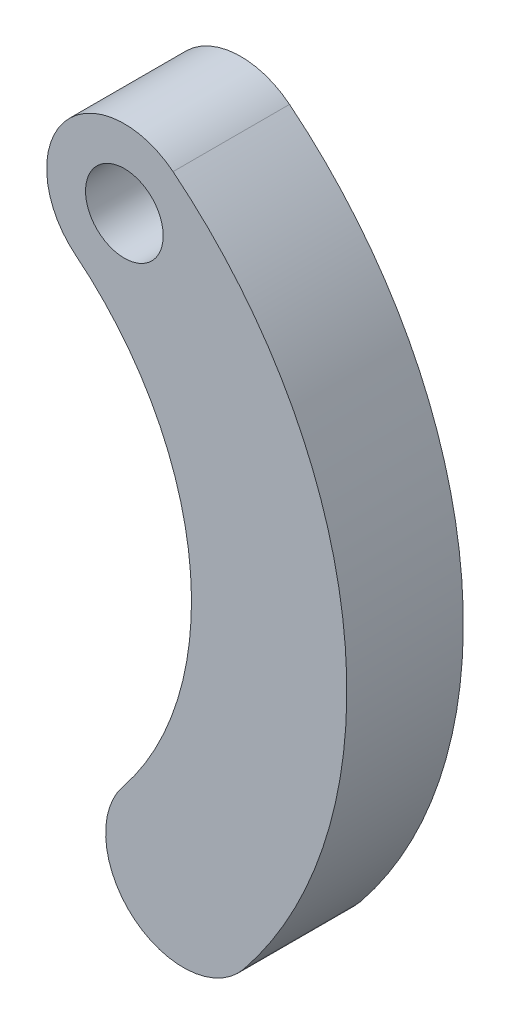
ISO-10303-21;
HEADER;
FILE_DESCRIPTION(('STEP AP214'),'2;1');
FILE_NAME('part.step','',(''),(''),'','','');
FILE_SCHEMA(('AUTOMOTIVE_DESIGN { 1 0 10303 214 1 1 1 1 }'));
ENDSEC;
DATA;
#1=APPLICATION_CONTEXT('core data for automotive mechanical design processes');
#2=APPLICATION_PROTOCOL_DEFINITION('international standard','automotive_design',2000,#1);
#3=PRODUCT_CONTEXT('',#1,'mechanical');
#4=PRODUCT('Part','Part','',(#3));
#5=PRODUCT_RELATED_PRODUCT_CATEGORY('part','',(#4));
#6=PRODUCT_DEFINITION_FORMATION('','',#4);
#7=PRODUCT_DEFINITION_CONTEXT('part definition',#1,'design');
#8=PRODUCT_DEFINITION('design','',#6,#7);
#9=PRODUCT_DEFINITION_SHAPE('','',#8);
#10=(LENGTH_UNIT() NAMED_UNIT(*) SI_UNIT(.MILLI.,.METRE.));
#11=(NAMED_UNIT(*) PLANE_ANGLE_UNIT() SI_UNIT($,.RADIAN.));
#12=(NAMED_UNIT(*) SI_UNIT($,.STERADIAN.) SOLID_ANGLE_UNIT());
#13=UNCERTAINTY_MEASURE_WITH_UNIT(LENGTH_MEASURE(1.E-05),#10,'distance_accuracy_value','');
#14=(GEOMETRIC_REPRESENTATION_CONTEXT(3) GLOBAL_UNCERTAINTY_ASSIGNED_CONTEXT((#13)) GLOBAL_UNIT_ASSIGNED_CONTEXT((#10,
#11,#12)) REPRESENTATION_CONTEXT('',''));
#15=CARTESIAN_POINT('',(0.,0.,0.));
#16=DIRECTION('',(0.,0.,1.));
#17=DIRECTION('',(1.,0.,0.));
#18=AXIS2_PLACEMENT_3D('',#15,#16,#17);
#19=CARTESIAN_POINT('',(-2.37615621415008,-1.42492021233816,3.));
#20=DIRECTION('',(0.,0.,1.));
#21=DIRECTION('',(1.,0.,0.));
#22=AXIS2_PLACEMENT_3D('',#19,#20,#21);
#23=PLANE('',#22);
#24=CARTESIAN_POINT('',(1.51858062795517,-4.56036674046586,3.));
#25=DIRECTION('',(0.,0.,1.));
#26=DIRECTION('',(1.,0.,0.));
#27=AXIS2_PLACEMENT_3D('',#24,#25,#26);
#28=CIRCLE('',#27,2.);
#29=CARTESIAN_POINT('',(-0.0393141088869346,-3.30618812921478,3.));
#30=VERTEX_POINT('',#29);
#31=CARTESIAN_POINT('',(3.07647536479727,-5.81454535171694,3.));
#32=VERTEX_POINT('',#31);
#33=EDGE_CURVE('E85',#30,#32,#28,.T.);
#34=ORIENTED_EDGE('',*,*,#33,.T.);
#35=CARTESIAN_POINT('',(-6.27089305625533,1.71052631578953,3.));
#36=DIRECTION('',(0.,0.,1.));
#37=DIRECTION('',(1.,0.,0.));
#38=AXIS2_PLACEMENT_3D('',#35,#36,#37);
#39=CIRCLE('',#38,12.);
#40=CARTESIAN_POINT('',(1.25417861125115,11.0578947368421,3.));
#41=VERTEX_POINT('',#40);
#42=EDGE_CURVE('E80',#32,#41,#39,.T.);
#43=ORIENTED_EDGE('',*,*,#42,.T.);
#44=CARTESIAN_POINT('',(0.,9.50000000000003,3.));
#45=DIRECTION('',(0.,0.,1.));
#46=DIRECTION('',(1.,0.,0.));
#47=AXIS2_PLACEMENT_3D('',#44,#45,#46);
#48=CIRCLE('',#47,2.);
#49=CARTESIAN_POINT('',(-1.25417861125101,7.94210526315793,3.));
#50=VERTEX_POINT('',#49);
#51=EDGE_CURVE('E83',#41,#50,#48,.T.);
#52=ORIENTED_EDGE('',*,*,#51,.T.);
#53=CARTESIAN_POINT('',(-6.27089305625533,1.71052631578953,3.));
#54=DIRECTION('',(0.,0.,-1.));
#55=DIRECTION('',(1.,0.,0.));
#56=AXIS2_PLACEMENT_3D('',#53,#54,#55);
#57=CIRCLE('',#56,8.);
#58=EDGE_CURVE('E50',#50,#30,#57,.T.);
#59=ORIENTED_EDGE('',*,*,#58,.T.);
#60=EDGE_LOOP('',(#34,#43,#52,#59));
#61=FACE_BOUND('',#60,.T.);
#62=CARTESIAN_POINT('',(0.,9.50000000000003,3.));
#63=DIRECTION('',(0.,0.,1.));
#64=DIRECTION('',(1.,0.,0.));
#65=AXIS2_PLACEMENT_3D('',#62,#63,#64);
#66=CIRCLE('',#65,1.);
#67=CARTESIAN_POINT('',(1.00000000000007,9.50000000000003,3.));
#68=VERTEX_POINT('',#67);
#69=EDGE_CURVE('E100',#68,#68,#66,.T.);
#70=ORIENTED_EDGE('',*,*,#69,.F.);
#71=EDGE_LOOP('',(#70));
#72=FACE_BOUND('',#71,.T.);
#73=ADVANCED_FACE('F33',(#61,#72),#23,.T.);
#74=CARTESIAN_POINT('',(-2.37615621415008,-1.42492021233816,0.));
#75=DIRECTION('',(0.,0.,1.));
#76=DIRECTION('',(1.,0.,0.));
#77=AXIS2_PLACEMENT_3D('',#74,#75,#76);
#78=PLANE('',#77);
#79=CARTESIAN_POINT('',(1.51858062795517,-4.56036674046586,0.));
#80=DIRECTION('',(0.,0.,1.));
#81=DIRECTION('',(1.,0.,0.));
#82=AXIS2_PLACEMENT_3D('',#79,#80,#81);
#83=CIRCLE('',#82,2.);
#84=CARTESIAN_POINT('',(-0.0393141088869346,-3.30618812921478,0.));
#85=VERTEX_POINT('',#84);
#86=CARTESIAN_POINT('',(3.07647536479727,-5.81454535171694,0.));
#87=VERTEX_POINT('',#86);
#88=EDGE_CURVE('E97',#85,#87,#83,.T.);
#89=ORIENTED_EDGE('',*,*,#88,.F.);
#90=CARTESIAN_POINT('',(-6.27089305625533,1.71052631578953,0.));
#91=DIRECTION('',(0.,0.,-1.));
#92=DIRECTION('',(1.,0.,0.));
#93=AXIS2_PLACEMENT_3D('',#90,#91,#92);
#94=CIRCLE('',#93,8.);
#95=CARTESIAN_POINT('',(-1.25417861125101,7.94210526315793,0.));
#96=VERTEX_POINT('',#95);
#97=EDGE_CURVE('E73',#96,#85,#94,.T.);
#98=ORIENTED_EDGE('',*,*,#97,.F.);
#99=CARTESIAN_POINT('',(0.,9.50000000000003,0.));
#100=DIRECTION('',(0.,0.,1.));
#101=DIRECTION('',(1.,0.,0.));
#102=AXIS2_PLACEMENT_3D('',#99,#100,#101);
#103=CIRCLE('',#102,2.);
#104=CARTESIAN_POINT('',(1.25417861125115,11.0578947368421,0.));
#105=VERTEX_POINT('',#104);
#106=EDGE_CURVE('E67',#105,#96,#103,.T.);
#107=ORIENTED_EDGE('',*,*,#106,.F.);
#108=CARTESIAN_POINT('',(-6.27089305625533,1.71052631578953,0.));
#109=DIRECTION('',(0.,0.,1.));
#110=DIRECTION('',(1.,0.,0.));
#111=AXIS2_PLACEMENT_3D('',#108,#109,#110);
#112=CIRCLE('',#111,12.);
#113=EDGE_CURVE('E89',#87,#105,#112,.T.);
#114=ORIENTED_EDGE('',*,*,#113,.F.);
#115=EDGE_LOOP('',(#89,#98,#107,#114));
#116=FACE_BOUND('',#115,.T.);
#117=CARTESIAN_POINT('',(0.,9.50000000000003,0.));
#118=DIRECTION('',(0.,0.,1.));
#119=DIRECTION('',(1.,0.,0.));
#120=AXIS2_PLACEMENT_3D('',#117,#118,#119);
#121=CIRCLE('',#120,1.);
#122=CARTESIAN_POINT('',(1.00000000000007,9.50000000000003,0.));
#123=VERTEX_POINT('',#122);
#124=EDGE_CURVE('E112',#123,#123,#121,.T.);
#125=ORIENTED_EDGE('',*,*,#124,.T.);
#126=EDGE_LOOP('',(#125));
#127=FACE_BOUND('',#126,.T.);
#128=ADVANCED_FACE('F108',(#116,#127),#78,.F.);
#129=CARTESIAN_POINT('',(1.51858062795517,-4.56036674046586,3.));
#130=DIRECTION('',(0.,0.,-1.));
#131=DIRECTION('',(-1.,0.,0.));
#132=AXIS2_PLACEMENT_3D('',#129,#130,#131);
#133=CYLINDRICAL_SURFACE('',#132,2.);
#134=ORIENTED_EDGE('',*,*,#88,.T.);
#135=DIRECTION('',(0.,0.,-1.));
#136=VECTOR('',#135,1.);
#137=CARTESIAN_POINT('',(3.07647536479727,-5.81454535171694,3.));
#138=LINE('',#137,#136);
#139=EDGE_CURVE('E11',#32,#87,#138,.T.);
#140=ORIENTED_EDGE('',*,*,#139,.F.);
#141=ORIENTED_EDGE('',*,*,#33,.F.);
#142=DIRECTION('',(0.,0.,-1.));
#143=VECTOR('',#142,1.);
#144=CARTESIAN_POINT('',(-0.0393141088869346,-3.30618812921478,3.));
#145=LINE('',#144,#143);
#146=EDGE_CURVE('E93',#30,#85,#145,.T.);
#147=ORIENTED_EDGE('',*,*,#146,.T.);
#148=EDGE_LOOP('',(#134,#140,#141,#147));
#149=FACE_BOUND('',#148,.T.);
#150=ADVANCED_FACE('F35',(#149),#133,.T.);
#151=CARTESIAN_POINT('',(-6.27089305625533,1.71052631578953,3.));
#152=DIRECTION('',(0.,0.,-1.));
#153=DIRECTION('',(-1.,0.,0.));
#154=AXIS2_PLACEMENT_3D('',#151,#152,#153);
#155=CYLINDRICAL_SURFACE('',#154,12.);
#156=ORIENTED_EDGE('',*,*,#113,.T.);
#157=DIRECTION('',(0.,0.,-1.));
#158=VECTOR('',#157,1.);
#159=CARTESIAN_POINT('',(1.25417861125115,11.0578947368421,3.));
#160=LINE('',#159,#158);
#161=EDGE_CURVE('E42',#41,#105,#160,.T.);
#162=ORIENTED_EDGE('',*,*,#161,.F.);
#163=ORIENTED_EDGE('',*,*,#42,.F.);
#164=ORIENTED_EDGE('',*,*,#139,.T.);
#165=EDGE_LOOP('',(#156,#162,#163,#164));
#166=FACE_BOUND('',#165,.T.);
#167=ADVANCED_FACE('F88',(#166),#155,.T.);
#168=CARTESIAN_POINT('',(0.,9.50000000000003,3.));
#169=DIRECTION('',(0.,0.,-1.));
#170=DIRECTION('',(-1.,0.,0.));
#171=AXIS2_PLACEMENT_3D('',#168,#169,#170);
#172=CYLINDRICAL_SURFACE('',#171,2.);
#173=ORIENTED_EDGE('',*,*,#106,.T.);
#174=DIRECTION('',(0.,0.,-1.));
#175=VECTOR('',#174,1.);
#176=CARTESIAN_POINT('',(-1.25417861125101,7.94210526315793,3.));
#177=LINE('',#176,#175);
#178=EDGE_CURVE('E90',#50,#96,#177,.T.);
#179=ORIENTED_EDGE('',*,*,#178,.F.);
#180=ORIENTED_EDGE('',*,*,#51,.F.);
#181=ORIENTED_EDGE('',*,*,#161,.T.);
#182=EDGE_LOOP('',(#173,#179,#180,#181));
#183=FACE_BOUND('',#182,.T.);
#184=ADVANCED_FACE('F91',(#183),#172,.T.);
#185=CARTESIAN_POINT('',(-6.27089305625533,1.71052631578953,3.));
#186=DIRECTION('',(0.,0.,-1.));
#187=DIRECTION('',(-1.,0.,0.));
#188=AXIS2_PLACEMENT_3D('',#185,#186,#187);
#189=CYLINDRICAL_SURFACE('',#188,8.);
#190=ORIENTED_EDGE('',*,*,#97,.T.);
#191=ORIENTED_EDGE('',*,*,#146,.F.);
#192=ORIENTED_EDGE('',*,*,#58,.F.);
#193=ORIENTED_EDGE('',*,*,#178,.T.);
#194=EDGE_LOOP('',(#190,#191,#192,#193));
#195=FACE_BOUND('',#194,.T.);
#196=ADVANCED_FACE('F105',(#195),#189,.F.);
#197=CARTESIAN_POINT('',(0.,9.50000000000003,3.));
#198=DIRECTION('',(0.,0.,-1.));
#199=DIRECTION('',(-1.,0.,0.));
#200=AXIS2_PLACEMENT_3D('',#197,#198,#199);
#201=CYLINDRICAL_SURFACE('',#200,1.);
#202=ORIENTED_EDGE('',*,*,#69,.T.);
#203=EDGE_LOOP('',(#202));
#204=FACE_BOUND('',#203,.T.);
#205=ORIENTED_EDGE('',*,*,#124,.F.);
#206=EDGE_LOOP('',(#205));
#207=FACE_BOUND('',#206,.T.);
#208=ADVANCED_FACE('F118',(#204,#207),#201,.F.);
#209=CLOSED_SHELL('',(#73,#128,#150,#167,#184,#196,#208));
#210=MANIFOLD_SOLID_BREP('B2',#209);
#211=ADVANCED_BREP_SHAPE_REPRESENTATION('',(#18,#210),#14);
#212=SHAPE_DEFINITION_REPRESENTATION(#9,#211);
ENDSEC;
END-ISO-10303-21;
